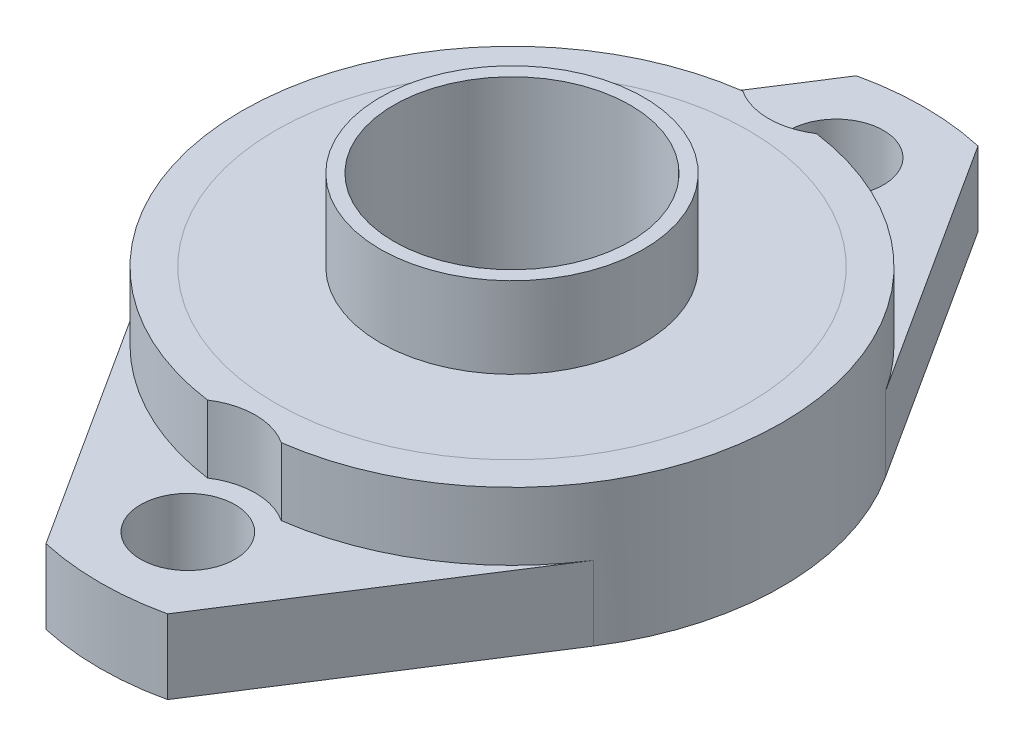
ISO-10303-21;
HEADER;
FILE_DESCRIPTION(('STEP AP214'),'2;1');
FILE_NAME('part.step','',(''),(''),'','','');
FILE_SCHEMA(('AUTOMOTIVE_DESIGN { 1 0 10303 214 1 1 1 1 }'));
ENDSEC;
DATA;
#1=APPLICATION_CONTEXT('core data for automotive mechanical design processes');
#2=APPLICATION_PROTOCOL_DEFINITION('international standard','automotive_design',2000,#1);
#3=PRODUCT_CONTEXT('',#1,'mechanical');
#4=PRODUCT('Part','Part','',(#3));
#5=PRODUCT_RELATED_PRODUCT_CATEGORY('part','',(#4));
#6=PRODUCT_DEFINITION_FORMATION('','',#4);
#7=PRODUCT_DEFINITION_CONTEXT('part definition',#1,'design');
#8=PRODUCT_DEFINITION('design','',#6,#7);
#9=PRODUCT_DEFINITION_SHAPE('','',#8);
#10=(LENGTH_UNIT() NAMED_UNIT(*) SI_UNIT(.MILLI.,.METRE.));
#11=(NAMED_UNIT(*) PLANE_ANGLE_UNIT() SI_UNIT($,.RADIAN.));
#12=(NAMED_UNIT(*) SI_UNIT($,.STERADIAN.) SOLID_ANGLE_UNIT());
#13=UNCERTAINTY_MEASURE_WITH_UNIT(LENGTH_MEASURE(1.E-05),#10,'distance_accuracy_value','');
#14=(GEOMETRIC_REPRESENTATION_CONTEXT(3) GLOBAL_UNCERTAINTY_ASSIGNED_CONTEXT((#13)) GLOBAL_UNIT_ASSIGNED_CONTEXT((#10,
#11,#12)) REPRESENTATION_CONTEXT('',''));
#15=CARTESIAN_POINT('',(0.,0.,0.));
#16=DIRECTION('',(0.,0.,1.));
#17=DIRECTION('',(1.,0.,0.));
#18=AXIS2_PLACEMENT_3D('',#15,#16,#17);
#19=CARTESIAN_POINT('',(0.,-55.1543289325507,0.));
#20=DIRECTION('',(0.,1.,0.));
#21=DIRECTION('',(0.,0.,1.));
#22=AXIS2_PLACEMENT_3D('',#19,#20,#21);
#23=CYLINDRICAL_SURFACE('',#22,19.5);
#24=CARTESIAN_POINT('',(0.,33.,0.));
#25=DIRECTION('',(0.,1.,0.));
#26=DIRECTION('',(0.,0.,1.));
#27=AXIS2_PLACEMENT_3D('',#24,#25,#26);
#28=CIRCLE('',#27,19.5);
#29=CARTESIAN_POINT('',(0.,33.,19.5));
#30=VERTEX_POINT('',#29);
#31=EDGE_CURVE('E11',#30,#30,#28,.T.);
#32=ORIENTED_EDGE('',*,*,#31,.F.);
#33=EDGE_LOOP('',(#32));
#34=FACE_BOUND('',#33,.T.);
#35=CARTESIAN_POINT('',(0.,3.,0.));
#36=DIRECTION('',(0.,-1.,0.));
#37=DIRECTION('',(0.,0.,-1.));
#38=AXIS2_PLACEMENT_3D('',#35,#36,#37);
#39=CIRCLE('',#38,19.5);
#40=CARTESIAN_POINT('',(0.,3.,-19.5));
#41=VERTEX_POINT('',#40);
#42=EDGE_CURVE('E53',#41,#41,#39,.F.);
#43=ORIENTED_EDGE('',*,*,#42,.T.);
#44=EDGE_LOOP('',(#43));
#45=FACE_BOUND('',#44,.T.);
#46=ADVANCED_FACE('F42',(#34,#45),#23,.T.);
#47=CARTESIAN_POINT('',(0.,-55.1543289325507,0.));
#48=DIRECTION('',(0.,1.,0.));
#49=DIRECTION('',(0.,0.,1.));
#50=AXIS2_PLACEMENT_3D('',#47,#48,#49);
#51=CYLINDRICAL_SURFACE('',#50,17.5);
#52=CARTESIAN_POINT('',(0.,33.,0.));
#53=DIRECTION('',(0.,1.,0.));
#54=DIRECTION('',(0.,0.,1.));
#55=AXIS2_PLACEMENT_3D('',#52,#53,#54);
#56=CIRCLE('',#55,17.5);
#57=CARTESIAN_POINT('',(0.,33.,17.5));
#58=VERTEX_POINT('',#57);
#59=EDGE_CURVE('E49',#58,#58,#56,.T.);
#60=ORIENTED_EDGE('',*,*,#59,.T.);
#61=EDGE_LOOP('',(#60));
#62=FACE_BOUND('',#61,.T.);
#63=CARTESIAN_POINT('',(0.,3.,0.));
#64=DIRECTION('',(0.,-1.,0.));
#65=DIRECTION('',(0.,0.,-1.));
#66=AXIS2_PLACEMENT_3D('',#63,#64,#65);
#67=CIRCLE('',#66,17.5);
#68=CARTESIAN_POINT('',(0.,3.,-17.5));
#69=VERTEX_POINT('',#68);
#70=EDGE_CURVE('E45',#69,#69,#67,.F.);
#71=ORIENTED_EDGE('',*,*,#70,.F.);
#72=EDGE_LOOP('',(#71));
#73=FACE_BOUND('',#72,.T.);
#74=ADVANCED_FACE('F64',(#62,#73),#51,.F.);
#75=CARTESIAN_POINT('',(0.,33.,0.));
#76=DIRECTION('',(0.,1.,0.));
#77=DIRECTION('',(0.,0.,1.));
#78=AXIS2_PLACEMENT_3D('',#75,#76,#77);
#79=PLANE('',#78);
#80=ORIENTED_EDGE('',*,*,#31,.T.);
#81=EDGE_LOOP('',(#80));
#82=FACE_BOUND('',#81,.T.);
#83=ORIENTED_EDGE('',*,*,#59,.F.);
#84=EDGE_LOOP('',(#83));
#85=FACE_BOUND('',#84,.T.);
#86=ADVANCED_FACE('F66',(#82,#85),#79,.T.);
#87=CARTESIAN_POINT('',(0.,3.,0.));
#88=DIRECTION('',(0.,-1.,0.));
#89=DIRECTION('',(0.,0.,-1.));
#90=AXIS2_PLACEMENT_3D('',#87,#88,#89);
#91=PLANE('',#90);
#92=ORIENTED_EDGE('',*,*,#42,.F.);
#93=EDGE_LOOP('',(#92));
#94=FACE_BOUND('',#93,.T.);
#95=ORIENTED_EDGE('',*,*,#70,.T.);
#96=EDGE_LOOP('',(#95));
#97=FACE_BOUND('',#96,.T.);
#98=ADVANCED_FACE('F62',(#94,#97),#91,.T.);
#99=CLOSED_SHELL('',(#46,#74,#86,#98));
#100=MANIFOLD_SOLID_BREP('B2',#99);
#101=CARTESIAN_POINT('',(0.,-98.9949493661167,0.));
#102=DIRECTION('',(0.,1.,0.));
#103=DIRECTION('',(0.,0.,1.));
#104=AXIS2_PLACEMENT_3D('',#101,#102,#103);
#105=CYLINDRICAL_SURFACE('',#104,35.);
#106=CARTESIAN_POINT('',(0.,21.,0.));
#107=DIRECTION('',(0.,1.,0.));
#108=DIRECTION('',(0.,0.,1.));
#109=AXIS2_PLACEMENT_3D('',#106,#107,#108);
#110=CIRCLE('',#109,35.);
#111=CARTESIAN_POINT('',(0.,21.,35.));
#112=VERTEX_POINT('',#111);
#113=EDGE_CURVE('E41',#112,#112,#110,.T.);
#114=ORIENTED_EDGE('',*,*,#113,.F.);
#115=EDGE_LOOP('',(#114));
#116=FACE_BOUND('',#115,.T.);
#117=CARTESIAN_POINT('',(0.,3.,0.));
#118=DIRECTION('',(0.,-1.,0.));
#119=DIRECTION('',(0.,0.,-1.));
#120=AXIS2_PLACEMENT_3D('',#117,#118,#119);
#121=CIRCLE('',#120,35.);
#122=CARTESIAN_POINT('',(0.,3.,-35.));
#123=VERTEX_POINT('',#122);
#124=EDGE_CURVE('E126',#123,#123,#121,.T.);
#125=ORIENTED_EDGE('',*,*,#124,.F.);
#126=EDGE_LOOP('',(#125));
#127=FACE_BOUND('',#126,.T.);
#128=ADVANCED_FACE('F113',(#116,#127),#105,.T.);
#129=CARTESIAN_POINT('',(0.,-98.9949493661167,0.));
#130=DIRECTION('',(0.,1.,0.));
#131=DIRECTION('',(0.,0.,1.));
#132=AXIS2_PLACEMENT_3D('',#129,#130,#131);
#133=CYLINDRICAL_SURFACE('',#132,19.5);
#134=CARTESIAN_POINT('',(0.,21.,0.));
#135=DIRECTION('',(0.,1.,0.));
#136=DIRECTION('',(0.,0.,1.));
#137=AXIS2_PLACEMENT_3D('',#134,#135,#136);
#138=CIRCLE('',#137,19.5);
#139=CARTESIAN_POINT('',(0.,21.,19.5));
#140=VERTEX_POINT('',#139);
#141=EDGE_CURVE('E120',#140,#140,#138,.T.);
#142=ORIENTED_EDGE('',*,*,#141,.T.);
#143=EDGE_LOOP('',(#142));
#144=FACE_BOUND('',#143,.T.);
#145=CARTESIAN_POINT('',(0.,3.,0.));
#146=DIRECTION('',(0.,-1.,0.));
#147=DIRECTION('',(0.,0.,-1.));
#148=AXIS2_PLACEMENT_3D('',#145,#146,#147);
#149=CIRCLE('',#148,19.5);
#150=CARTESIAN_POINT('',(0.,3.,-19.5));
#151=VERTEX_POINT('',#150);
#152=EDGE_CURVE('E116',#151,#151,#149,.F.);
#153=ORIENTED_EDGE('',*,*,#152,.F.);
#154=EDGE_LOOP('',(#153));
#155=FACE_BOUND('',#154,.T.);
#156=ADVANCED_FACE('F135',(#144,#155),#133,.F.);
#157=CARTESIAN_POINT('',(0.,21.,0.));
#158=DIRECTION('',(0.,1.,0.));
#159=DIRECTION('',(0.,0.,1.));
#160=AXIS2_PLACEMENT_3D('',#157,#158,#159);
#161=PLANE('',#160);
#162=ORIENTED_EDGE('',*,*,#141,.F.);
#163=EDGE_LOOP('',(#162));
#164=FACE_BOUND('',#163,.T.);
#165=ORIENTED_EDGE('',*,*,#113,.T.);
#166=EDGE_LOOP('',(#165));
#167=FACE_BOUND('',#166,.T.);
#168=ADVANCED_FACE('F137',(#164,#167),#161,.T.);
#169=CARTESIAN_POINT('',(0.,3.,0.));
#170=DIRECTION('',(0.,-1.,0.));
#171=DIRECTION('',(0.,0.,-1.));
#172=AXIS2_PLACEMENT_3D('',#169,#170,#171);
#173=PLANE('',#172);
#174=ORIENTED_EDGE('',*,*,#124,.T.);
#175=EDGE_LOOP('',(#174));
#176=FACE_BOUND('',#175,.T.);
#177=ORIENTED_EDGE('',*,*,#152,.T.);
#178=EDGE_LOOP('',(#177));
#179=FACE_BOUND('',#178,.T.);
#180=ADVANCED_FACE('F133',(#176,#179),#173,.T.);
#181=CLOSED_SHELL('',(#128,#156,#168,#180));
#182=MANIFOLD_SOLID_BREP('B6',#181);
#183=CARTESIAN_POINT('',(0.,11.,0.));
#184=DIRECTION('',(0.,-1.,0.));
#185=DIRECTION('',(0.,0.,-1.));
#186=AXIS2_PLACEMENT_3D('',#183,#184,#185);
#187=CYLINDRICAL_SURFACE('',#186,40.);
#188=CARTESIAN_POINT('',(0.,11.,0.));
#189=DIRECTION('',(0.,1.,0.));
#190=DIRECTION('',(0.,0.,1.));
#191=AXIS2_PLACEMENT_3D('',#188,#189,#190);
#192=CIRCLE('',#191,40.);
#193=CARTESIAN_POINT('',(33.6547539767421,11.,-21.6184535701554));
#194=VERTEX_POINT('',#193);
#195=CARTESIAN_POINT('',(5.46437324859859,11.,-39.625));
#196=VERTEX_POINT('',#195);
#197=EDGE_CURVE('E183',#194,#196,#192,.T.);
#198=ORIENTED_EDGE('',*,*,#197,.T.);
#199=DIRECTION('',(0.,1.,0.));
#200=VECTOR('',#199,1.);
#201=CARTESIAN_POINT('',(5.46437324859859,16.,-39.625));
#202=LINE('',#201,#200);
#203=CARTESIAN_POINT('',(5.46437324859859,21.,-39.625));
#204=VERTEX_POINT('',#203);
#205=EDGE_CURVE('E295',#196,#204,#202,.T.);
#206=ORIENTED_EDGE('',*,*,#205,.T.);
#207=CARTESIAN_POINT('',(0.,21.,0.));
#208=DIRECTION('',(0.,1.,0.));
#209=DIRECTION('',(0.,0.,1.));
#210=AXIS2_PLACEMENT_3D('',#207,#208,#209);
#211=CIRCLE('',#210,40.);
#212=CARTESIAN_POINT('',(5.46437324859859,21.,39.625));
#213=VERTEX_POINT('',#212);
#214=EDGE_CURVE('E318',#213,#204,#211,.T.);
#215=ORIENTED_EDGE('',*,*,#214,.F.);
#216=DIRECTION('',(0.,1.,0.));
#217=VECTOR('',#216,1.);
#218=CARTESIAN_POINT('',(5.46437324859859,16.,39.625));
#219=LINE('',#218,#217);
#220=CARTESIAN_POINT('',(5.46437324859859,11.,39.625));
#221=VERTEX_POINT('',#220);
#222=EDGE_CURVE('E197',#213,#221,#219,.F.);
#223=ORIENTED_EDGE('',*,*,#222,.T.);
#224=CARTESIAN_POINT('',(33.6547539767421,11.,21.6184535701554));
#225=VERTEX_POINT('',#224);
#226=EDGE_CURVE('E278',#221,#225,#192,.T.);
#227=ORIENTED_EDGE('',*,*,#226,.T.);
#228=DIRECTION('',(0.,-1.,0.));
#229=VECTOR('',#228,1.);
#230=CARTESIAN_POINT('',(33.6547539767421,11.,21.6184535701554));
#231=LINE('',#230,#229);
#232=CARTESIAN_POINT('',(33.6547539767421,0.,21.6184535701554));
#233=VERTEX_POINT('',#232);
#234=EDGE_CURVE('E287',#225,#233,#231,.T.);
#235=ORIENTED_EDGE('',*,*,#234,.T.);
#236=CARTESIAN_POINT('',(0.,0.,0.));
#237=DIRECTION('',(0.,1.,0.));
#238=DIRECTION('',(0.,0.,1.));
#239=AXIS2_PLACEMENT_3D('',#236,#237,#238);
#240=CIRCLE('',#239,40.);
#241=CARTESIAN_POINT('',(33.6547539767421,0.,-21.6184535701554));
#242=VERTEX_POINT('',#241);
#243=EDGE_CURVE('E322',#233,#242,#240,.T.);
#244=ORIENTED_EDGE('',*,*,#243,.T.);
#245=DIRECTION('',(0.,-1.,0.));
#246=VECTOR('',#245,1.);
#247=CARTESIAN_POINT('',(33.6547539767421,11.,-21.6184535701554));
#248=LINE('',#247,#246);
#249=EDGE_CURVE('E298',#194,#242,#248,.T.);
#250=ORIENTED_EDGE('',*,*,#249,.F.);
#251=EDGE_LOOP('',(#198,#206,#215,#223,#227,#235,#244,#250));
#252=FACE_BOUND('',#251,.T.);
#253=ADVANCED_FACE('F175',(#252),#187,.T.);
#254=CARTESIAN_POINT('',(0.,11.,0.));
#255=DIRECTION('',(0.,1.,0.));
#256=DIRECTION('',(0.,0.,1.));
#257=AXIS2_PLACEMENT_3D('',#254,#255,#256);
#258=PLANE('',#257);
#259=CARTESIAN_POINT('',(-5.46437324859859,11.,-39.625));
#260=VERTEX_POINT('',#259);
#261=CARTESIAN_POINT('',(-33.6547539767421,11.,-21.6184535701554));
#262=VERTEX_POINT('',#261);
#263=EDGE_CURVE('E285',#260,#262,#192,.T.);
#264=ORIENTED_EDGE('',*,*,#263,.F.);
#265=CARTESIAN_POINT('',(0.,11.,-48.));
#266=DIRECTION('',(0.,1.,0.));
#267=DIRECTION('',(0.,0.,1.));
#268=AXIS2_PLACEMENT_3D('',#265,#266,#267);
#269=CIRCLE('',#268,10.);
#270=EDGE_CURVE('E279',#196,#260,#269,.F.);
#271=ORIENTED_EDGE('',*,*,#270,.F.);
#272=ORIENTED_EDGE('',*,*,#197,.F.);
#273=DIRECTION('',(-0.540461339253884,0.,-0.841368849418552));
#274=VECTOR('',#273,1.);
#275=CARTESIAN_POINT('',(33.6547539767421,11.,-21.6184535701554));
#276=LINE('',#275,#274);
#277=CARTESIAN_POINT('',(9.00000000000001,11.,-60.));
#278=VERTEX_POINT('',#277);
#279=EDGE_CURVE('E306',#194,#278,#276,.T.);
#280=ORIENTED_EDGE('',*,*,#279,.T.);
#281=CARTESIAN_POINT('',(0.,11.,-20.));
#282=DIRECTION('',(0.,1.,0.));
#283=DIRECTION('',(0.,0.,1.));
#284=AXIS2_PLACEMENT_3D('',#281,#282,#283);
#285=CIRCLE('',#284,41.);
#286=CARTESIAN_POINT('',(-9.00000000000001,11.,-60.));
#287=VERTEX_POINT('',#286);
#288=EDGE_CURVE('E339',#287,#278,#285,.F.);
#289=ORIENTED_EDGE('',*,*,#288,.F.);
#290=DIRECTION('',(0.540461339253884,0.,-0.841368849418552));
#291=VECTOR('',#290,1.);
#292=CARTESIAN_POINT('',(-33.6547539767421,11.,-21.6184535701554));
#293=LINE('',#292,#291);
#294=EDGE_CURVE('E333',#262,#287,#293,.T.);
#295=ORIENTED_EDGE('',*,*,#294,.F.);
#296=EDGE_LOOP('',(#264,#271,#272,#280,#289,#295));
#297=FACE_BOUND('',#296,.T.);
#298=CARTESIAN_POINT('',(0.,11.,-48.));
#299=DIRECTION('',(0.,1.,0.));
#300=DIRECTION('',(0.,0.,1.));
#301=AXIS2_PLACEMENT_3D('',#298,#299,#300);
#302=CIRCLE('',#301,7.);
#303=CARTESIAN_POINT('',(0.,11.,-41.));
#304=VERTEX_POINT('',#303);
#305=EDGE_CURVE('E348',#304,#304,#302,.T.);
#306=ORIENTED_EDGE('',*,*,#305,.F.);
#307=EDGE_LOOP('',(#306));
#308=FACE_BOUND('',#307,.T.);
#309=ADVANCED_FACE('F303',(#297,#308),#258,.T.);
#310=CARTESIAN_POINT('',(33.6547539767421,11.,21.6184535701554));
#311=DIRECTION('',(0.841368849418552,0.,0.540461339253884));
#312=DIRECTION('',(0.540461339253884,0.,-0.841368849418552));
#313=AXIS2_PLACEMENT_3D('',#310,#311,#312);
#314=PLANE('',#313);
#315=DIRECTION('',(-0.540461339253884,0.,0.841368849418552));
#316=VECTOR('',#315,1.);
#317=CARTESIAN_POINT('',(33.6547539767421,0.,21.6184535701554));
#318=LINE('',#317,#316);
#319=CARTESIAN_POINT('',(9.00000000000001,0.,60.));
#320=VERTEX_POINT('',#319);
#321=EDGE_CURVE('E319',#233,#320,#318,.T.);
#322=ORIENTED_EDGE('',*,*,#321,.F.);
#323=ORIENTED_EDGE('',*,*,#234,.F.);
#324=DIRECTION('',(-0.540461339253884,0.,0.841368849418552));
#325=VECTOR('',#324,1.);
#326=CARTESIAN_POINT('',(33.6547539767421,11.,21.6184535701554));
#327=LINE('',#326,#325);
#328=CARTESIAN_POINT('',(9.00000000000001,11.,60.));
#329=VERTEX_POINT('',#328);
#330=EDGE_CURVE('E379',#225,#329,#327,.T.);
#331=ORIENTED_EDGE('',*,*,#330,.T.);
#332=DIRECTION('',(0.,-1.,0.));
#333=VECTOR('',#332,1.);
#334=CARTESIAN_POINT('',(9.00000000000001,11.,60.));
#335=LINE('',#334,#333);
#336=EDGE_CURVE('E353',#329,#320,#335,.T.);
#337=ORIENTED_EDGE('',*,*,#336,.T.);
#338=EDGE_LOOP('',(#322,#323,#331,#337));
#339=FACE_BOUND('',#338,.T.);
#340=ADVANCED_FACE('F177',(#339),#314,.T.);
#341=CARTESIAN_POINT('',(33.6547539767421,11.,-21.6184535701554));
#342=DIRECTION('',(-0.841368849418552,0.,0.540461339253884));
#343=DIRECTION('',(0.540461339253884,0.,0.841368849418552));
#344=AXIS2_PLACEMENT_3D('',#341,#342,#343);
#345=PLANE('',#344);
#346=DIRECTION('',(-0.540461339253884,0.,-0.841368849418552));
#347=VECTOR('',#346,1.);
#348=CARTESIAN_POINT('',(33.6547539767421,0.,-21.6184535701554));
#349=LINE('',#348,#347);
#350=CARTESIAN_POINT('',(9.00000000000001,0.,-60.));
#351=VERTEX_POINT('',#350);
#352=EDGE_CURVE('E356',#242,#351,#349,.T.);
#353=ORIENTED_EDGE('',*,*,#352,.T.);
#354=DIRECTION('',(0.,-1.,0.));
#355=VECTOR('',#354,1.);
#356=CARTESIAN_POINT('',(9.00000000000001,11.,-60.));
#357=LINE('',#356,#355);
#358=EDGE_CURVE('E386',#278,#351,#357,.T.);
#359=ORIENTED_EDGE('',*,*,#358,.F.);
#360=ORIENTED_EDGE('',*,*,#279,.F.);
#361=ORIENTED_EDGE('',*,*,#249,.T.);
#362=EDGE_LOOP('',(#353,#359,#360,#361));
#363=FACE_BOUND('',#362,.T.);
#364=ADVANCED_FACE('F428',(#363),#345,.F.);
#365=CARTESIAN_POINT('',(0.,11.,-20.));
#366=DIRECTION('',(0.,-1.,0.));
#367=DIRECTION('',(0.,0.,-1.));
#368=AXIS2_PLACEMENT_3D('',#365,#366,#367);
#369=CYLINDRICAL_SURFACE('',#368,41.);
#370=CARTESIAN_POINT('',(0.,0.,-20.));
#371=DIRECTION('',(0.,1.,0.));
#372=DIRECTION('',(0.,0.,1.));
#373=AXIS2_PLACEMENT_3D('',#370,#371,#372);
#374=CIRCLE('',#373,41.);
#375=CARTESIAN_POINT('',(-9.00000000000001,0.,-60.));
#376=VERTEX_POINT('',#375);
#377=EDGE_CURVE('E359',#376,#351,#374,.F.);
#378=ORIENTED_EDGE('',*,*,#377,.F.);
#379=DIRECTION('',(0.,-1.,0.));
#380=VECTOR('',#379,1.);
#381=CARTESIAN_POINT('',(-9.00000000000001,11.,-60.));
#382=LINE('',#381,#380);
#383=EDGE_CURVE('E336',#287,#376,#382,.T.);
#384=ORIENTED_EDGE('',*,*,#383,.F.);
#385=ORIENTED_EDGE('',*,*,#288,.T.);
#386=ORIENTED_EDGE('',*,*,#358,.T.);
#387=EDGE_LOOP('',(#378,#384,#385,#386));
#388=FACE_BOUND('',#387,.T.);
#389=ADVANCED_FACE('F426',(#388),#369,.T.);
#390=CARTESIAN_POINT('',(-33.6547539767421,11.,-21.6184535701554));
#391=DIRECTION('',(-0.841368849418552,0.,-0.540461339253884));
#392=DIRECTION('',(-0.540461339253884,0.,0.841368849418552));
#393=AXIS2_PLACEMENT_3D('',#390,#391,#392);
#394=PLANE('',#393);
#395=DIRECTION('',(0.540461339253884,0.,-0.841368849418552));
#396=VECTOR('',#395,1.);
#397=CARTESIAN_POINT('',(-33.6547539767421,0.,-21.6184535701554));
#398=LINE('',#397,#396);
#399=CARTESIAN_POINT('',(-33.6547539767421,0.,-21.6184535701554));
#400=VERTEX_POINT('',#399);
#401=EDGE_CURVE('E335',#400,#376,#398,.T.);
#402=ORIENTED_EDGE('',*,*,#401,.F.);
#403=DIRECTION('',(0.,-1.,0.));
#404=VECTOR('',#403,1.);
#405=CARTESIAN_POINT('',(-33.6547539767421,11.,-21.6184535701554));
#406=LINE('',#405,#404);
#407=EDGE_CURVE('E327',#262,#400,#406,.T.);
#408=ORIENTED_EDGE('',*,*,#407,.F.);
#409=ORIENTED_EDGE('',*,*,#294,.T.);
#410=ORIENTED_EDGE('',*,*,#383,.T.);
#411=EDGE_LOOP('',(#402,#408,#409,#410));
#412=FACE_BOUND('',#411,.T.);
#413=ADVANCED_FACE('F332',(#412),#394,.T.);
#414=CARTESIAN_POINT('',(-5.46437324859859,21.,-39.625));
#415=VERTEX_POINT('',#414);
#416=CARTESIAN_POINT('',(-5.46437324859859,21.,39.625));
#417=VERTEX_POINT('',#416);
#418=EDGE_CURVE('E317',#415,#417,#211,.T.);
#419=ORIENTED_EDGE('',*,*,#418,.F.);
#420=DIRECTION('',(0.,1.,0.));
#421=VECTOR('',#420,1.);
#422=CARTESIAN_POINT('',(-5.46437324859859,16.,-39.625));
#423=LINE('',#422,#421);
#424=EDGE_CURVE('E189',#415,#260,#423,.F.);
#425=ORIENTED_EDGE('',*,*,#424,.T.);
#426=ORIENTED_EDGE('',*,*,#263,.T.);
#427=ORIENTED_EDGE('',*,*,#407,.T.);
#428=CARTESIAN_POINT('',(0.,0.,0.));
#429=DIRECTION('',(0.,1.,0.));
#430=DIRECTION('',(0.,0.,1.));
#431=AXIS2_PLACEMENT_3D('',#428,#429,#430);
#432=CIRCLE('',#431,40.);
#433=CARTESIAN_POINT('',(-33.6547539767421,0.,21.6184535701554));
#434=VERTEX_POINT('',#433);
#435=EDGE_CURVE('E363',#400,#434,#432,.T.);
#436=ORIENTED_EDGE('',*,*,#435,.T.);
#437=DIRECTION('',(0.,-1.,0.));
#438=VECTOR('',#437,1.);
#439=CARTESIAN_POINT('',(-33.6547539767421,11.,21.6184535701554));
#440=LINE('',#439,#438);
#441=CARTESIAN_POINT('',(-33.6547539767421,11.,21.6184535701554));
#442=VERTEX_POINT('',#441);
#443=EDGE_CURVE('E283',#442,#434,#440,.T.);
#444=ORIENTED_EDGE('',*,*,#443,.F.);
#445=CARTESIAN_POINT('',(-5.46437324859859,11.,39.625));
#446=VERTEX_POINT('',#445);
#447=EDGE_CURVE('E275',#442,#446,#192,.T.);
#448=ORIENTED_EDGE('',*,*,#447,.T.);
#449=DIRECTION('',(0.,1.,0.));
#450=VECTOR('',#449,1.);
#451=CARTESIAN_POINT('',(-5.46437324859859,16.,39.625));
#452=LINE('',#451,#450);
#453=EDGE_CURVE('E261',#446,#417,#452,.T.);
#454=ORIENTED_EDGE('',*,*,#453,.T.);
#455=EDGE_LOOP('',(#419,#425,#426,#427,#436,#444,#448,#454));
#456=FACE_BOUND('',#455,.T.);
#457=ADVANCED_FACE('F281',(#456),#187,.T.);
#458=CARTESIAN_POINT('',(-33.6547539767421,11.,21.6184535701554));
#459=DIRECTION('',(0.841368849418552,0.,-0.540461339253884));
#460=DIRECTION('',(-0.540461339253884,0.,-0.841368849418552));
#461=AXIS2_PLACEMENT_3D('',#458,#459,#460);
#462=PLANE('',#461);
#463=DIRECTION('',(0.540461339253884,0.,0.841368849418552));
#464=VECTOR('',#463,1.);
#465=CARTESIAN_POINT('',(-33.6547539767421,0.,21.6184535701554));
#466=LINE('',#465,#464);
#467=CARTESIAN_POINT('',(-9.00000000000001,0.,60.));
#468=VERTEX_POINT('',#467);
#469=EDGE_CURVE('E365',#434,#468,#466,.T.);
#470=ORIENTED_EDGE('',*,*,#469,.T.);
#471=DIRECTION('',(0.,-1.,0.));
#472=VECTOR('',#471,1.);
#473=CARTESIAN_POINT('',(-9.00000000000001,11.,60.));
#474=LINE('',#473,#472);
#475=CARTESIAN_POINT('',(-9.00000000000001,11.,60.));
#476=VERTEX_POINT('',#475);
#477=EDGE_CURVE('E381',#476,#468,#474,.T.);
#478=ORIENTED_EDGE('',*,*,#477,.F.);
#479=DIRECTION('',(0.540461339253884,0.,0.841368849418552));
#480=VECTOR('',#479,1.);
#481=CARTESIAN_POINT('',(-33.6547539767421,11.,21.6184535701554));
#482=LINE('',#481,#480);
#483=EDGE_CURVE('E340',#442,#476,#482,.T.);
#484=ORIENTED_EDGE('',*,*,#483,.F.);
#485=ORIENTED_EDGE('',*,*,#443,.T.);
#486=EDGE_LOOP('',(#470,#478,#484,#485));
#487=FACE_BOUND('',#486,.T.);
#488=ADVANCED_FACE('F405',(#487),#462,.F.);
#489=CARTESIAN_POINT('',(0.,11.,0.));
#490=DIRECTION('',(0.,-1.,0.));
#491=DIRECTION('',(0.,0.,-1.));
#492=AXIS2_PLACEMENT_3D('',#489,#490,#491);
#493=CYLINDRICAL_SURFACE('',#492,35.);
#494=CARTESIAN_POINT('',(0.,0.,0.));
#495=DIRECTION('',(0.,1.,0.));
#496=DIRECTION('',(0.,0.,1.));
#497=AXIS2_PLACEMENT_3D('',#494,#495,#496);
#498=CIRCLE('',#497,35.);
#499=CARTESIAN_POINT('',(0.,0.,35.));
#500=VERTEX_POINT('',#499);
#501=EDGE_CURVE('E373',#500,#500,#498,.T.);
#502=ORIENTED_EDGE('',*,*,#501,.F.);
#503=EDGE_LOOP('',(#502));
#504=FACE_BOUND('',#503,.T.);
#505=CARTESIAN_POINT('',(0.,21.,0.));
#506=DIRECTION('',(0.,1.,0.));
#507=DIRECTION('',(0.,0.,1.));
#508=AXIS2_PLACEMENT_3D('',#505,#506,#507);
#509=CIRCLE('',#508,35.);
#510=CARTESIAN_POINT('',(0.,21.,35.));
#511=VERTEX_POINT('',#510);
#512=EDGE_CURVE('E315',#511,#511,#509,.T.);
#513=ORIENTED_EDGE('',*,*,#512,.T.);
#514=EDGE_LOOP('',(#513));
#515=FACE_BOUND('',#514,.T.);
#516=ADVANCED_FACE('F407',(#504,#515),#493,.F.);
#517=CARTESIAN_POINT('',(0.,11.,-48.));
#518=DIRECTION('',(0.,-1.,0.));
#519=DIRECTION('',(0.,0.,-1.));
#520=AXIS2_PLACEMENT_3D('',#517,#518,#519);
#521=CYLINDRICAL_SURFACE('',#520,7.);
#522=ORIENTED_EDGE('',*,*,#305,.T.);
#523=EDGE_LOOP('',(#522));
#524=FACE_BOUND('',#523,.T.);
#525=CARTESIAN_POINT('',(0.,0.,-48.));
#526=DIRECTION('',(0.,1.,0.));
#527=DIRECTION('',(0.,0.,1.));
#528=AXIS2_PLACEMENT_3D('',#525,#526,#527);
#529=CIRCLE('',#528,7.);
#530=CARTESIAN_POINT('',(0.,0.,-41.));
#531=VERTEX_POINT('',#530);
#532=EDGE_CURVE('E370',#531,#531,#529,.T.);
#533=ORIENTED_EDGE('',*,*,#532,.F.);
#534=EDGE_LOOP('',(#533));
#535=FACE_BOUND('',#534,.T.);
#536=ADVANCED_FACE('F413',(#524,#535),#521,.F.);
#537=CARTESIAN_POINT('',(0.,11.,20.));
#538=DIRECTION('',(0.,-1.,0.));
#539=DIRECTION('',(0.,0.,-1.));
#540=AXIS2_PLACEMENT_3D('',#537,#538,#539);
#541=CYLINDRICAL_SURFACE('',#540,41.);
#542=CARTESIAN_POINT('',(0.,0.,20.));
#543=DIRECTION('',(0.,1.,0.));
#544=DIRECTION('',(0.,0.,1.));
#545=AXIS2_PLACEMENT_3D('',#542,#543,#544);
#546=CIRCLE('',#545,41.);
#547=EDGE_CURVE('E367',#468,#320,#546,.T.);
#548=ORIENTED_EDGE('',*,*,#547,.T.);
#549=ORIENTED_EDGE('',*,*,#336,.F.);
#550=CARTESIAN_POINT('',(0.,11.,20.));
#551=DIRECTION('',(0.,1.,0.));
#552=DIRECTION('',(0.,0.,1.));
#553=AXIS2_PLACEMENT_3D('',#550,#551,#552);
#554=CIRCLE('',#553,41.);
#555=EDGE_CURVE('E342',#476,#329,#554,.T.);
#556=ORIENTED_EDGE('',*,*,#555,.F.);
#557=ORIENTED_EDGE('',*,*,#477,.T.);
#558=EDGE_LOOP('',(#548,#549,#556,#557));
#559=FACE_BOUND('',#558,.T.);
#560=ADVANCED_FACE('F401',(#559),#541,.T.);
#561=CARTESIAN_POINT('',(0.,11.,48.));
#562=DIRECTION('',(0.,-1.,0.));
#563=DIRECTION('',(0.,0.,-1.));
#564=AXIS2_PLACEMENT_3D('',#561,#562,#563);
#565=CYLINDRICAL_SURFACE('',#564,7.);
#566=CARTESIAN_POINT('',(0.,11.,48.));
#567=DIRECTION('',(0.,1.,0.));
#568=DIRECTION('',(0.,0.,1.));
#569=AXIS2_PLACEMENT_3D('',#566,#567,#568);
#570=CIRCLE('',#569,7.);
#571=CARTESIAN_POINT('',(0.,11.,55.));
#572=VERTEX_POINT('',#571);
#573=EDGE_CURVE('E351',#572,#572,#570,.F.);
#574=ORIENTED_EDGE('',*,*,#573,.F.);
#575=EDGE_LOOP('',(#574));
#576=FACE_BOUND('',#575,.T.);
#577=CARTESIAN_POINT('',(0.,0.,48.));
#578=DIRECTION('',(0.,1.,0.));
#579=DIRECTION('',(0.,0.,1.));
#580=AXIS2_PLACEMENT_3D('',#577,#578,#579);
#581=CIRCLE('',#580,7.);
#582=CARTESIAN_POINT('',(0.,0.,55.));
#583=VERTEX_POINT('',#582);
#584=EDGE_CURVE('E376',#583,#583,#581,.F.);
#585=ORIENTED_EDGE('',*,*,#584,.T.);
#586=EDGE_LOOP('',(#585));
#587=FACE_BOUND('',#586,.T.);
#588=ADVANCED_FACE('F464',(#576,#587),#565,.F.);
#589=ORIENTED_EDGE('',*,*,#226,.F.);
#590=CARTESIAN_POINT('',(0.,11.,48.));
#591=DIRECTION('',(0.,1.,0.));
#592=DIRECTION('',(0.,0.,1.));
#593=AXIS2_PLACEMENT_3D('',#590,#591,#592);
#594=CIRCLE('',#593,10.);
#595=EDGE_CURVE('E264',#446,#221,#594,.F.);
#596=ORIENTED_EDGE('',*,*,#595,.F.);
#597=ORIENTED_EDGE('',*,*,#447,.F.);
#598=ORIENTED_EDGE('',*,*,#483,.T.);
#599=ORIENTED_EDGE('',*,*,#555,.T.);
#600=ORIENTED_EDGE('',*,*,#330,.F.);
#601=EDGE_LOOP('',(#589,#596,#597,#598,#599,#600));
#602=FACE_BOUND('',#601,.T.);
#603=ORIENTED_EDGE('',*,*,#573,.T.);
#604=EDGE_LOOP('',(#603));
#605=FACE_BOUND('',#604,.T.);
#606=ADVANCED_FACE('F273',(#602,#605),#258,.T.);
#607=CARTESIAN_POINT('',(0.,0.,0.));
#608=DIRECTION('',(0.,1.,0.));
#609=DIRECTION('',(0.,0.,1.));
#610=AXIS2_PLACEMENT_3D('',#607,#608,#609);
#611=PLANE('',#610);
#612=ORIENTED_EDGE('',*,*,#321,.T.);
#613=ORIENTED_EDGE('',*,*,#547,.F.);
#614=ORIENTED_EDGE('',*,*,#469,.F.);
#615=ORIENTED_EDGE('',*,*,#435,.F.);
#616=ORIENTED_EDGE('',*,*,#401,.T.);
#617=ORIENTED_EDGE('',*,*,#377,.T.);
#618=ORIENTED_EDGE('',*,*,#352,.F.);
#619=ORIENTED_EDGE('',*,*,#243,.F.);
#620=EDGE_LOOP('',(#612,#613,#614,#615,#616,#617,#618,#619));
#621=FACE_BOUND('',#620,.T.);
#622=ORIENTED_EDGE('',*,*,#532,.T.);
#623=EDGE_LOOP('',(#622));
#624=FACE_BOUND('',#623,.T.);
#625=ORIENTED_EDGE('',*,*,#501,.T.);
#626=EDGE_LOOP('',(#625));
#627=FACE_BOUND('',#626,.T.);
#628=ORIENTED_EDGE('',*,*,#584,.F.);
#629=EDGE_LOOP('',(#628));
#630=FACE_BOUND('',#629,.T.);
#631=ADVANCED_FACE('F395',(#621,#624,#627,#630),#611,.F.);
#632=CARTESIAN_POINT('',(0.,21.,0.));
#633=DIRECTION('',(0.,1.,0.));
#634=DIRECTION('',(0.,0.,1.));
#635=AXIS2_PLACEMENT_3D('',#632,#633,#634);
#636=PLANE('',#635);
#637=CARTESIAN_POINT('',(0.,21.,-48.));
#638=DIRECTION('',(0.,1.,0.));
#639=DIRECTION('',(0.,0.,1.));
#640=AXIS2_PLACEMENT_3D('',#637,#638,#639);
#641=CIRCLE('',#640,10.);
#642=EDGE_CURVE('E111',#415,#204,#641,.T.);
#643=ORIENTED_EDGE('',*,*,#642,.F.);
#644=ORIENTED_EDGE('',*,*,#418,.T.);
#645=CARTESIAN_POINT('',(0.,21.,48.));
#646=DIRECTION('',(0.,1.,0.));
#647=DIRECTION('',(0.,0.,1.));
#648=AXIS2_PLACEMENT_3D('',#645,#646,#647);
#649=CIRCLE('',#648,10.);
#650=EDGE_CURVE('E265',#213,#417,#649,.T.);
#651=ORIENTED_EDGE('',*,*,#650,.F.);
#652=ORIENTED_EDGE('',*,*,#214,.T.);
#653=EDGE_LOOP('',(#643,#644,#651,#652));
#654=FACE_BOUND('',#653,.T.);
#655=ORIENTED_EDGE('',*,*,#512,.F.);
#656=EDGE_LOOP('',(#655));
#657=FACE_BOUND('',#656,.T.);
#658=ADVANCED_FACE('F324',(#654,#657),#636,.T.);
#659=CARTESIAN_POINT('',(0.,-17.2842712474619,48.));
#660=DIRECTION('',(0.,1.,0.));
#661=DIRECTION('',(0.,0.,1.));
#662=AXIS2_PLACEMENT_3D('',#659,#660,#661);
#663=CYLINDRICAL_SURFACE('',#662,10.);
#664=ORIENTED_EDGE('',*,*,#595,.T.);
#665=ORIENTED_EDGE('',*,*,#222,.F.);
#666=ORIENTED_EDGE('',*,*,#650,.T.);
#667=ORIENTED_EDGE('',*,*,#453,.F.);
#668=EDGE_LOOP('',(#664,#665,#666,#667));
#669=FACE_BOUND('',#668,.T.);
#670=ADVANCED_FACE('F263',(#669),#663,.F.);
#671=CARTESIAN_POINT('',(0.,-17.2842712474619,-48.));
#672=DIRECTION('',(0.,1.,0.));
#673=DIRECTION('',(0.,0.,1.));
#674=AXIS2_PLACEMENT_3D('',#671,#672,#673);
#675=CYLINDRICAL_SURFACE('',#674,10.);
#676=ORIENTED_EDGE('',*,*,#270,.T.);
#677=ORIENTED_EDGE('',*,*,#424,.F.);
#678=ORIENTED_EDGE('',*,*,#642,.T.);
#679=ORIENTED_EDGE('',*,*,#205,.F.);
#680=EDGE_LOOP('',(#676,#677,#678,#679));
#681=FACE_BOUND('',#680,.T.);
#682=ADVANCED_FACE('F484',(#681),#675,.F.);
#683=CLOSED_SHELL('',(#253,#309,#340,#364,#389,#413,#457,#488,#516,#536,#560,#588,#606,#631,
#658,#670,#682));
#684=MANIFOLD_SOLID_BREP('B36',#683);
#685=ADVANCED_BREP_SHAPE_REPRESENTATION('',(#18,#100,#182,#684),#14);
#686=SHAPE_DEFINITION_REPRESENTATION(#9,#685);
ENDSEC;
END-ISO-10303-21;
